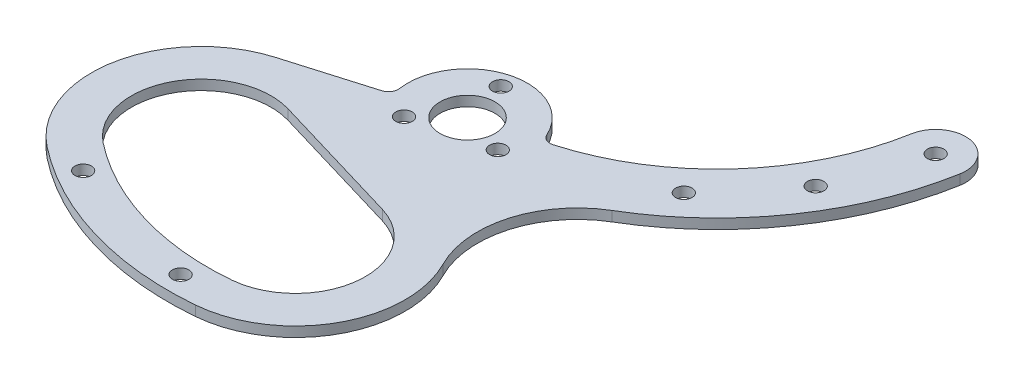
ISO-10303-21;
HEADER;
FILE_DESCRIPTION(('STEP AP214'),'2;1');
FILE_NAME('part.step','',(''),(''),'','','');
FILE_SCHEMA(('AUTOMOTIVE_DESIGN { 1 0 10303 214 1 1 1 1 }'));
ENDSEC;
DATA;
#1=APPLICATION_CONTEXT('core data for automotive mechanical design processes');
#2=APPLICATION_PROTOCOL_DEFINITION('international standard','automotive_design',2000,#1);
#3=PRODUCT_CONTEXT('',#1,'mechanical');
#4=PRODUCT('Part','Part','',(#3));
#5=PRODUCT_RELATED_PRODUCT_CATEGORY('part','',(#4));
#6=PRODUCT_DEFINITION_FORMATION('','',#4);
#7=PRODUCT_DEFINITION_CONTEXT('part definition',#1,'design');
#8=PRODUCT_DEFINITION('design','',#6,#7);
#9=PRODUCT_DEFINITION_SHAPE('','',#8);
#10=(LENGTH_UNIT() NAMED_UNIT(*) SI_UNIT(.MILLI.,.METRE.));
#11=(NAMED_UNIT(*) PLANE_ANGLE_UNIT() SI_UNIT($,.RADIAN.));
#12=(NAMED_UNIT(*) SI_UNIT($,.STERADIAN.) SOLID_ANGLE_UNIT());
#13=UNCERTAINTY_MEASURE_WITH_UNIT(LENGTH_MEASURE(1.E-05),#10,'distance_accuracy_value','');
#14=(GEOMETRIC_REPRESENTATION_CONTEXT(3) GLOBAL_UNCERTAINTY_ASSIGNED_CONTEXT((#13)) GLOBAL_UNIT_ASSIGNED_CONTEXT((#10,
#11,#12)) REPRESENTATION_CONTEXT('',''));
#15=CARTESIAN_POINT('',(0.,0.,0.));
#16=DIRECTION('',(0.,0.,1.));
#17=DIRECTION('',(1.,0.,0.));
#18=AXIS2_PLACEMENT_3D('',#15,#16,#17);
#19=CARTESIAN_POINT('',(53.1796186626592,2.,-40.6229984059855));
#20=DIRECTION('',(0.,-1.,0.));
#21=DIRECTION('',(0.,0.,-1.));
#22=AXIS2_PLACEMENT_3D('',#19,#20,#21);
#23=PLANE('',#22);
#24=CARTESIAN_POINT('',(-1.5107921294575,2.,55.9796168899142));
#25=DIRECTION('',(0.,1.,0.));
#26=DIRECTION('',(0.,0.,-1.));
#27=AXIS2_PLACEMENT_3D('',#24,#25,#26);
#28=CIRCLE('',#27,1.64999999999998);
#29=CARTESIAN_POINT('',(-1.5107921294575,2.,54.3296168899142));
#30=VERTEX_POINT('',#29);
#31=EDGE_CURVE('E187',#30,#30,#28,.T.);
#32=ORIENTED_EDGE('',*,*,#31,.F.);
#33=EDGE_LOOP('',(#32));
#34=FACE_BOUND('',#33,.T.);
#35=CARTESIAN_POINT('',(-29.298192808905,2.,47.7243742560574));
#36=DIRECTION('',(0.,1.,0.));
#37=DIRECTION('',(0.,0.,1.));
#38=AXIS2_PLACEMENT_3D('',#35,#36,#37);
#39=CIRCLE('',#38,1.65);
#40=CARTESIAN_POINT('',(-29.298192808905,2.,49.3743742560573));
#41=VERTEX_POINT('',#40);
#42=EDGE_CURVE('E193',#41,#41,#39,.T.);
#43=ORIENTED_EDGE('',*,*,#42,.F.);
#44=EDGE_LOOP('',(#43));
#45=FACE_BOUND('',#44,.T.);
#46=CARTESIAN_POINT('',(53.1796186626592,2.,-40.6229984059855));
#47=DIRECTION('',(0.,1.,0.));
#48=DIRECTION('',(0.,0.,-1.));
#49=AXIS2_PLACEMENT_3D('',#46,#47,#48);
#50=CIRCLE('',#49,5.99999999999999);
#51=CARTESIAN_POINT('',(59.0884651807324,2.,-39.5811093399839));
#52=VERTEX_POINT('',#51);
#53=CARTESIAN_POINT('',(47.2707721445859,2.,-41.6648874719871));
#54=VERTEX_POINT('',#53);
#55=EDGE_CURVE('E199',#52,#54,#50,.T.);
#56=ORIENTED_EDGE('',*,*,#55,.T.);
#57=CARTESIAN_POINT('',(0.,2.,-50.));
#58=DIRECTION('',(0.,-1.,0.));
#59=DIRECTION('',(0.,0.,-1.));
#60=AXIS2_PLACEMENT_3D('',#57,#58,#59);
#61=CIRCLE('',#60,48.);
#62=CARTESIAN_POINT('',(13.2960587989118,2.,-3.87826086956521));
#63=VERTEX_POINT('',#62);
#64=EDGE_CURVE('E202',#54,#63,#61,.T.);
#65=ORIENTED_EDGE('',*,*,#64,.T.);
#66=CARTESIAN_POINT('',(12.7420563489572,2.,-5.8));
#67=DIRECTION('',(0.,-1.,0.));
#68=DIRECTION('',(0.,0.,-1.));
#69=AXIS2_PLACEMENT_3D('',#66,#67,#68);
#70=CIRCLE('',#69,2.);
#71=CARTESIAN_POINT('',(10.9217625848204,2.,-4.97142857142857));
#72=VERTEX_POINT('',#71);
#73=EDGE_CURVE('E11',#63,#72,#70,.T.);
#74=ORIENTED_EDGE('',*,*,#73,.T.);
#75=CARTESIAN_POINT('',(0.,2.,0.));
#76=DIRECTION('',(0.,1.,0.));
#77=DIRECTION('',(0.,0.,1.));
#78=AXIS2_PLACEMENT_3D('',#75,#76,#77);
#79=CIRCLE('',#78,12.);
#80=CARTESIAN_POINT('',(-11.875935655694,2.,1.72109043975488));
#81=VERTEX_POINT('',#80);
#82=EDGE_CURVE('E205',#72,#81,#79,.T.);
#83=ORIENTED_EDGE('',*,*,#82,.T.);
#84=CARTESIAN_POINT('',(-13.8552582649763,2.,2.00793884638069));
#85=DIRECTION('',(0.,-1.,0.));
#86=DIRECTION('',(0.,0.,-1.));
#87=AXIS2_PLACEMENT_3D('',#84,#85,#86);
#88=CIRCLE('',#87,2.);
#89=CARTESIAN_POINT('',(-13.2885915983097,2.,3.92598183048946));
#90=VERTEX_POINT('',#89);
#91=EDGE_CURVE('E270',#81,#90,#88,.T.);
#92=ORIENTED_EDGE('',*,*,#91,.T.);
#93=DIRECTION('',(-0.959021492054387,0.,0.283333333333334));
#94=VECTOR('',#93,1.);
#95=CARTESIAN_POINT('',(-11.5082579046526,2.,3.40000000000001));
#96=LINE('',#95,#94);
#97=CARTESIAN_POINT('',(-29.714194139053,2.,8.7787622514035));
#98=VERTEX_POINT('',#97);
#99=EDGE_CURVE('E208',#90,#98,#96,.T.);
#100=ORIENTED_EDGE('',*,*,#99,.T.);
#101=CARTESIAN_POINT('',(-23.4808608057197,2.,29.8772350766));
#102=DIRECTION('',(0.,1.,0.));
#103=DIRECTION('',(0.,0.,-1.));
#104=AXIS2_PLACEMENT_3D('',#101,#102,#103);
#105=CIRCLE('',#104,22.);
#106=CARTESIAN_POINT('',(-37.0750433774521,2.,47.1745816998947));
#107=VERTEX_POINT('',#106);
#108=EDGE_CURVE('E210',#98,#107,#105,.T.);
#109=ORIENTED_EDGE('',*,*,#108,.T.);
#110=CARTESIAN_POINT('',(0.,2.,0.));
#111=DIRECTION('',(0.,1.,0.));
#112=DIRECTION('',(0.,0.,-1.));
#113=AXIS2_PLACEMENT_3D('',#110,#111,#112);
#114=CIRCLE('',#113,60.);
#115=CARTESIAN_POINT('',(5.30480077263312,2.,59.7650323246183));
#116=VERTEX_POINT('',#115);
#117=EDGE_CURVE('E212',#107,#116,#114,.T.);
#118=ORIENTED_EDGE('',*,*,#117,.T.);
#119=CARTESIAN_POINT('',(3.35970715600097,2.,37.8511871389249));
#120=DIRECTION('',(0.,1.,0.));
#121=DIRECTION('',(0.,0.,1.));
#122=AXIS2_PLACEMENT_3D('',#119,#120,#121);
#123=CIRCLE('',#122,22.);
#124=CARTESIAN_POINT('',(22.9702579298318,2.,27.8799134817132));
#125=VERTEX_POINT('',#124);
#126=EDGE_CURVE('E214',#116,#125,#123,.T.);
#127=ORIENTED_EDGE('',*,*,#126,.T.);
#128=CARTESIAN_POINT('',(40.7980313605871,2.,18.8151192478844));
#129=DIRECTION('',(0.,-1.,0.));
#130=DIRECTION('',(0.,0.,1.));
#131=AXIS2_PLACEMENT_3D('',#128,#129,#130);
#132=CIRCLE('',#131,20.);
#133=CARTESIAN_POINT('',(30.5985235204403,2.,1.61133943591332));
#134=VERTEX_POINT('',#133);
#135=EDGE_CURVE('E216',#125,#134,#132,.T.);
#136=ORIENTED_EDGE('',*,*,#135,.T.);
#137=CARTESIAN_POINT('',(0.,2.,-50.));
#138=DIRECTION('',(0.,1.,0.));
#139=DIRECTION('',(0.,0.,-1.));
#140=AXIS2_PLACEMENT_3D('',#137,#138,#139);
#141=CIRCLE('',#140,60.);
#142=EDGE_CURVE('E218',#134,#52,#141,.T.);
#143=ORIENTED_EDGE('',*,*,#142,.T.);
#144=EDGE_LOOP('',(#56,#65,#74,#83,#92,#100,#109,#118,#127,#136,#143));
#145=FACE_BOUND('',#144,.T.);
#146=CARTESIAN_POINT('',(-23.4808608057197,2.,29.8772350766));
#147=DIRECTION('',(0.,1.,0.));
#148=DIRECTION('',(0.,0.,-1.));
#149=AXIS2_PLACEMENT_3D('',#146,#147,#148);
#150=CIRCLE('',#149,14.);
#151=CARTESIAN_POINT('',(-19.4938847745572,2.,16.4569510957397));
#152=VERTEX_POINT('',#151);
#153=CARTESIAN_POINT('',(-32.1317042604585,2.,40.8846374732421));
#154=VERTEX_POINT('',#153);
#155=EDGE_CURVE('E143',#152,#154,#150,.T.);
#156=ORIENTED_EDGE('',*,*,#155,.F.);
#157=DIRECTION('',(-0.958591712918594,0.,-0.28478400222589));
#158=VECTOR('',#157,1.);
#159=CARTESIAN_POINT('',(-19.4938847745572,2.,16.4569510957397));
#160=LINE('',#159,#158);
#161=CARTESIAN_POINT('',(7.34668318716343,2.,24.4309031580646));
#162=VERTEX_POINT('',#161);
#163=EDGE_CURVE('E169',#162,#152,#160,.T.);
#164=ORIENTED_EDGE('',*,*,#163,.F.);
#165=CARTESIAN_POINT('',(3.35970715600097,2.,37.8511871389249));
#166=DIRECTION('',(0.,1.,0.));
#167=DIRECTION('',(0.,0.,1.));
#168=AXIS2_PLACEMENT_3D('',#165,#166,#167);
#169=CIRCLE('',#168,14.);
#170=CARTESIAN_POINT('',(4.59749400294866,2.,51.7963613480025));
#171=VERTEX_POINT('',#170);
#172=EDGE_CURVE('E167',#171,#162,#169,.T.);
#173=ORIENTED_EDGE('',*,*,#172,.F.);
#174=CARTESIAN_POINT('',(0.,2.,0.));
#175=DIRECTION('',(0.,1.,0.));
#176=DIRECTION('',(0.,0.,1.));
#177=AXIS2_PLACEMENT_3D('',#174,#175,#176);
#178=CIRCLE('',#177,52.);
#179=EDGE_CURVE('E153',#154,#171,#178,.T.);
#180=ORIENTED_EDGE('',*,*,#179,.F.);
#181=EDGE_LOOP('',(#156,#164,#173,#180));
#182=FACE_BOUND('',#181,.T.);
#183=CARTESIAN_POINT('',(8.62732541626735,2.,2.56305602003301));
#184=DIRECTION('',(0.,1.,0.));
#185=DIRECTION('',(0.,0.,1.));
#186=AXIS2_PLACEMENT_3D('',#183,#184,#185);
#187=CIRCLE('',#186,1.65);
#188=CARTESIAN_POINT('',(8.62732541626735,2.,4.21305602003302));
#189=VERTEX_POINT('',#188);
#190=EDGE_CURVE('E176',#189,#189,#187,.T.);
#191=ORIENTED_EDGE('',*,*,#190,.F.);
#192=EDGE_LOOP('',(#191));
#193=FACE_BOUND('',#192,.T.);
#194=CARTESIAN_POINT('',(0.,2.,0.));
#195=DIRECTION('',(0.,1.,0.));
#196=DIRECTION('',(0.,0.,1.));
#197=AXIS2_PLACEMENT_3D('',#194,#195,#196);
#198=CIRCLE('',#197,5.5);
#199=CARTESIAN_POINT('',(0.,2.,5.5));
#200=VERTEX_POINT('',#199);
#201=EDGE_CURVE('E589',#200,#200,#198,.T.);
#202=ORIENTED_EDGE('',*,*,#201,.F.);
#203=EDGE_LOOP('',(#202));
#204=FACE_BOUND('',#203,.T.);
#205=CARTESIAN_POINT('',(-6.5333343328049,2.,6.18995496718617));
#206=DIRECTION('',(0.,1.,0.));
#207=DIRECTION('',(0.,0.,1.));
#208=AXIS2_PLACEMENT_3D('',#205,#206,#207);
#209=CIRCLE('',#208,1.65);
#210=CARTESIAN_POINT('',(-6.5333343328049,2.,7.83995496718617));
#211=VERTEX_POINT('',#210);
#212=EDGE_CURVE('E583',#211,#211,#209,.T.);
#213=ORIENTED_EDGE('',*,*,#212,.F.);
#214=EDGE_LOOP('',(#213));
#215=FACE_BOUND('',#214,.T.);
#216=CARTESIAN_POINT('',(-2.09399108346244,2.,-8.75301098721919));
#217=DIRECTION('',(0.,1.,0.));
#218=DIRECTION('',(0.,0.,1.));
#219=AXIS2_PLACEMENT_3D('',#216,#217,#218);
#220=CIRCLE('',#219,1.65);
#221=CARTESIAN_POINT('',(-2.09399108346244,2.,-7.10301098721919));
#222=VERTEX_POINT('',#221);
#223=EDGE_CURVE('E577',#222,#222,#220,.T.);
#224=ORIENTED_EDGE('',*,*,#223,.F.);
#225=EDGE_LOOP('',(#224));
#226=FACE_BOUND('',#225,.T.);
#227=CARTESIAN_POINT('',(53.1796186626592,2.,-40.6229984059855));
#228=DIRECTION('',(0.,1.,0.));
#229=DIRECTION('',(0.,0.,1.));
#230=AXIS2_PLACEMENT_3D('',#227,#228,#229);
#231=CIRCLE('',#230,1.65);
#232=CARTESIAN_POINT('',(53.1796186626592,2.,-38.9729984059855));
#233=VERTEX_POINT('',#232);
#234=EDGE_CURVE('E571',#233,#233,#231,.T.);
#235=ORIENTED_EDGE('',*,*,#234,.F.);
#236=EDGE_LOOP('',(#235));
#237=FACE_BOUND('',#236,.T.);
#238=CARTESIAN_POINT('',(46.7653718043596,2.,-22.9999999999998));
#239=DIRECTION('',(0.,1.,0.));
#240=DIRECTION('',(0.,0.,1.));
#241=AXIS2_PLACEMENT_3D('',#238,#239,#240);
#242=CIRCLE('',#241,1.65);
#243=CARTESIAN_POINT('',(46.7653718043596,2.,-21.3499999999998));
#244=VERTEX_POINT('',#243);
#245=EDGE_CURVE('E565',#244,#244,#242,.T.);
#246=ORIENTED_EDGE('',*,*,#245,.F.);
#247=EDGE_LOOP('',(#246));
#248=FACE_BOUND('',#247,.T.);
#249=CARTESIAN_POINT('',(34.7105309230729,2.,-8.63360007157498));
#250=DIRECTION('',(0.,1.,0.));
#251=DIRECTION('',(0.,0.,1.));
#252=AXIS2_PLACEMENT_3D('',#249,#250,#251);
#253=CIRCLE('',#252,1.65);
#254=CARTESIAN_POINT('',(34.7105309230729,2.,-6.98360007157498));
#255=VERTEX_POINT('',#254);
#256=EDGE_CURVE('E556',#255,#255,#253,.T.);
#257=ORIENTED_EDGE('',*,*,#256,.F.);
#258=EDGE_LOOP('',(#257));
#259=FACE_BOUND('',#258,.T.);
#260=ADVANCED_FACE('F37',(#34,#45,#145,#182,#193,#204,#215,#226,#237,#248,#259),#23,.F.);
#261=CARTESIAN_POINT('',(53.1796186626592,0.,-40.6229984059855));
#262=DIRECTION('',(0.,-1.,0.));
#263=DIRECTION('',(0.,0.,-1.));
#264=AXIS2_PLACEMENT_3D('',#261,#262,#263);
#265=PLANE('',#264);
#266=CARTESIAN_POINT('',(46.7653718043596,0.,-22.9999999999998));
#267=DIRECTION('',(0.,1.,0.));
#268=DIRECTION('',(0.,0.,1.));
#269=AXIS2_PLACEMENT_3D('',#266,#267,#268);
#270=CIRCLE('',#269,1.65);
#271=CARTESIAN_POINT('',(46.7653718043596,0.,-21.3499999999998));
#272=VERTEX_POINT('',#271);
#273=EDGE_CURVE('E562',#272,#272,#270,.T.);
#274=ORIENTED_EDGE('',*,*,#273,.T.);
#275=EDGE_LOOP('',(#274));
#276=FACE_BOUND('',#275,.T.);
#277=CARTESIAN_POINT('',(-2.09399108346244,0.,-8.75301098721919));
#278=DIRECTION('',(0.,1.,0.));
#279=DIRECTION('',(0.,0.,1.));
#280=AXIS2_PLACEMENT_3D('',#277,#278,#279);
#281=CIRCLE('',#280,1.65);
#282=CARTESIAN_POINT('',(-2.09399108346244,0.,-7.10301098721919));
#283=VERTEX_POINT('',#282);
#284=EDGE_CURVE('E574',#283,#283,#281,.T.);
#285=ORIENTED_EDGE('',*,*,#284,.T.);
#286=EDGE_LOOP('',(#285));
#287=FACE_BOUND('',#286,.T.);
#288=CARTESIAN_POINT('',(0.,0.,0.));
#289=DIRECTION('',(0.,1.,0.));
#290=DIRECTION('',(0.,0.,1.));
#291=AXIS2_PLACEMENT_3D('',#288,#289,#290);
#292=CIRCLE('',#291,5.5);
#293=CARTESIAN_POINT('',(0.,0.,5.5));
#294=VERTEX_POINT('',#293);
#295=EDGE_CURVE('E586',#294,#294,#292,.T.);
#296=ORIENTED_EDGE('',*,*,#295,.T.);
#297=EDGE_LOOP('',(#296));
#298=FACE_BOUND('',#297,.T.);
#299=DIRECTION('',(-0.958591712918594,0.,-0.28478400222589));
#300=VECTOR('',#299,1.);
#301=CARTESIAN_POINT('',(-19.4938847745572,0.,16.4569510957397));
#302=LINE('',#301,#300);
#303=CARTESIAN_POINT('',(7.34668318716343,0.,24.4309031580646));
#304=VERTEX_POINT('',#303);
#305=CARTESIAN_POINT('',(-19.4938847745572,0.,16.4569510957397));
#306=VERTEX_POINT('',#305);
#307=EDGE_CURVE('E154',#304,#306,#302,.T.);
#308=ORIENTED_EDGE('',*,*,#307,.T.);
#309=CARTESIAN_POINT('',(-23.4808608057197,0.,29.8772350766));
#310=DIRECTION('',(0.,1.,0.));
#311=DIRECTION('',(0.,0.,-1.));
#312=AXIS2_PLACEMENT_3D('',#309,#310,#311);
#313=CIRCLE('',#312,14.);
#314=CARTESIAN_POINT('',(-32.1317042604585,0.,40.8846374732421));
#315=VERTEX_POINT('',#314);
#316=EDGE_CURVE('E174',#306,#315,#313,.T.);
#317=ORIENTED_EDGE('',*,*,#316,.T.);
#318=CARTESIAN_POINT('',(0.,0.,0.));
#319=DIRECTION('',(0.,1.,0.));
#320=DIRECTION('',(0.,0.,1.));
#321=AXIS2_PLACEMENT_3D('',#318,#319,#320);
#322=CIRCLE('',#321,52.);
#323=CARTESIAN_POINT('',(4.59749400294866,0.,51.7963613480025));
#324=VERTEX_POINT('',#323);
#325=EDGE_CURVE('E160',#315,#324,#322,.T.);
#326=ORIENTED_EDGE('',*,*,#325,.T.);
#327=CARTESIAN_POINT('',(3.35970715600097,0.,37.8511871389249));
#328=DIRECTION('',(0.,1.,0.));
#329=DIRECTION('',(0.,0.,1.));
#330=AXIS2_PLACEMENT_3D('',#327,#328,#329);
#331=CIRCLE('',#330,14.);
#332=EDGE_CURVE('E178',#324,#304,#331,.T.);
#333=ORIENTED_EDGE('',*,*,#332,.T.);
#334=EDGE_LOOP('',(#308,#317,#326,#333));
#335=FACE_BOUND('',#334,.T.);
#336=CARTESIAN_POINT('',(-1.5107921294575,0.,55.9796168899142));
#337=DIRECTION('',(0.,1.,0.));
#338=DIRECTION('',(0.,0.,-1.));
#339=AXIS2_PLACEMENT_3D('',#336,#337,#338);
#340=CIRCLE('',#339,1.64999999999998);
#341=CARTESIAN_POINT('',(-1.5107921294575,0.,54.3296168899142));
#342=VERTEX_POINT('',#341);
#343=EDGE_CURVE('E161',#342,#342,#340,.T.);
#344=ORIENTED_EDGE('',*,*,#343,.T.);
#345=EDGE_LOOP('',(#344));
#346=FACE_BOUND('',#345,.T.);
#347=CARTESIAN_POINT('',(53.1796186626592,0.,-40.6229984059855));
#348=DIRECTION('',(0.,1.,0.));
#349=DIRECTION('',(0.,0.,-1.));
#350=AXIS2_PLACEMENT_3D('',#347,#348,#349);
#351=CIRCLE('',#350,5.99999999999999);
#352=CARTESIAN_POINT('',(59.0884651807324,0.,-39.5811093399839));
#353=VERTEX_POINT('',#352);
#354=CARTESIAN_POINT('',(47.2707721445859,0.,-41.6648874719871));
#355=VERTEX_POINT('',#354);
#356=EDGE_CURVE('E196',#353,#355,#351,.T.);
#357=ORIENTED_EDGE('',*,*,#356,.F.);
#358=CARTESIAN_POINT('',(0.,0.,-50.));
#359=DIRECTION('',(0.,1.,0.));
#360=DIRECTION('',(0.,0.,-1.));
#361=AXIS2_PLACEMENT_3D('',#358,#359,#360);
#362=CIRCLE('',#361,60.);
#363=CARTESIAN_POINT('',(30.5985235204403,0.,1.61133943591332));
#364=VERTEX_POINT('',#363);
#365=EDGE_CURVE('E203',#364,#353,#362,.T.);
#366=ORIENTED_EDGE('',*,*,#365,.F.);
#367=CARTESIAN_POINT('',(40.7980313605871,0.,18.8151192478844));
#368=DIRECTION('',(0.,-1.,0.));
#369=DIRECTION('',(0.,0.,1.));
#370=AXIS2_PLACEMENT_3D('',#367,#368,#369);
#371=CIRCLE('',#370,20.);
#372=CARTESIAN_POINT('',(22.9702579298318,0.,27.8799134817132));
#373=VERTEX_POINT('',#372);
#374=EDGE_CURVE('E236',#373,#364,#371,.T.);
#375=ORIENTED_EDGE('',*,*,#374,.F.);
#376=CARTESIAN_POINT('',(3.35970715600097,0.,37.8511871389249));
#377=DIRECTION('',(0.,1.,0.));
#378=DIRECTION('',(0.,0.,1.));
#379=AXIS2_PLACEMENT_3D('',#376,#377,#378);
#380=CIRCLE('',#379,22.);
#381=CARTESIAN_POINT('',(5.30480077263312,0.,59.7650323246183));
#382=VERTEX_POINT('',#381);
#383=EDGE_CURVE('E234',#382,#373,#380,.T.);
#384=ORIENTED_EDGE('',*,*,#383,.F.);
#385=CARTESIAN_POINT('',(0.,0.,0.));
#386=DIRECTION('',(0.,1.,0.));
#387=DIRECTION('',(0.,0.,-1.));
#388=AXIS2_PLACEMENT_3D('',#385,#386,#387);
#389=CIRCLE('',#388,60.);
#390=CARTESIAN_POINT('',(-37.0750433774521,0.,47.1745816998947));
#391=VERTEX_POINT('',#390);
#392=EDGE_CURVE('E232',#391,#382,#389,.T.);
#393=ORIENTED_EDGE('',*,*,#392,.F.);
#394=CARTESIAN_POINT('',(-23.4808608057197,0.,29.8772350766));
#395=DIRECTION('',(0.,1.,0.));
#396=DIRECTION('',(0.,0.,-1.));
#397=AXIS2_PLACEMENT_3D('',#394,#395,#396);
#398=CIRCLE('',#397,22.);
#399=CARTESIAN_POINT('',(-29.714194139053,0.,8.7787622514035));
#400=VERTEX_POINT('',#399);
#401=EDGE_CURVE('E230',#400,#391,#398,.T.);
#402=ORIENTED_EDGE('',*,*,#401,.F.);
#403=DIRECTION('',(-0.959021492054387,0.,0.283333333333334));
#404=VECTOR('',#403,1.);
#405=CARTESIAN_POINT('',(-11.5082579046526,0.,3.40000000000001));
#406=LINE('',#405,#404);
#407=CARTESIAN_POINT('',(-13.2885915983097,0.,3.92598183048946));
#408=VERTEX_POINT('',#407);
#409=EDGE_CURVE('E228',#408,#400,#406,.T.);
#410=ORIENTED_EDGE('',*,*,#409,.F.);
#411=CARTESIAN_POINT('',(-13.8552582649763,0.,2.00793884638069));
#412=DIRECTION('',(0.,-1.,0.));
#413=DIRECTION('',(0.,0.,-1.));
#414=AXIS2_PLACEMENT_3D('',#411,#412,#413);
#415=CIRCLE('',#414,2.);
#416=CARTESIAN_POINT('',(-11.875935655694,0.,1.72109043975488));
#417=VERTEX_POINT('',#416);
#418=EDGE_CURVE('E268',#408,#417,#415,.F.);
#419=ORIENTED_EDGE('',*,*,#418,.T.);
#420=CARTESIAN_POINT('',(0.,0.,0.));
#421=DIRECTION('',(0.,1.,0.));
#422=DIRECTION('',(0.,0.,1.));
#423=AXIS2_PLACEMENT_3D('',#420,#421,#422);
#424=CIRCLE('',#423,12.);
#425=CARTESIAN_POINT('',(10.9217625848204,0.,-4.97142857142857));
#426=VERTEX_POINT('',#425);
#427=EDGE_CURVE('E225',#426,#417,#424,.T.);
#428=ORIENTED_EDGE('',*,*,#427,.F.);
#429=CARTESIAN_POINT('',(12.7420563489572,0.,-5.8));
#430=DIRECTION('',(0.,-1.,0.));
#431=DIRECTION('',(0.,0.,-1.));
#432=AXIS2_PLACEMENT_3D('',#429,#430,#431);
#433=CIRCLE('',#432,2.);
#434=CARTESIAN_POINT('',(13.2960587989118,0.,-3.87826086956521));
#435=VERTEX_POINT('',#434);
#436=EDGE_CURVE('E45',#426,#435,#433,.F.);
#437=ORIENTED_EDGE('',*,*,#436,.T.);
#438=CARTESIAN_POINT('',(0.,0.,-50.));
#439=DIRECTION('',(0.,-1.,0.));
#440=DIRECTION('',(0.,0.,-1.));
#441=AXIS2_PLACEMENT_3D('',#438,#439,#440);
#442=CIRCLE('',#441,48.);
#443=EDGE_CURVE('E223',#355,#435,#442,.T.);
#444=ORIENTED_EDGE('',*,*,#443,.F.);
#445=EDGE_LOOP('',(#357,#366,#375,#384,#393,#402,#410,#419,#428,#437,#444));
#446=FACE_BOUND('',#445,.T.);
#447=CARTESIAN_POINT('',(-29.298192808905,0.,47.7243742560574));
#448=DIRECTION('',(0.,1.,0.));
#449=DIRECTION('',(0.,0.,1.));
#450=AXIS2_PLACEMENT_3D('',#447,#448,#449);
#451=CIRCLE('',#450,1.65);
#452=CARTESIAN_POINT('',(-29.298192808905,0.,49.3743742560573));
#453=VERTEX_POINT('',#452);
#454=EDGE_CURVE('E190',#453,#453,#451,.T.);
#455=ORIENTED_EDGE('',*,*,#454,.T.);
#456=EDGE_LOOP('',(#455));
#457=FACE_BOUND('',#456,.T.);
#458=CARTESIAN_POINT('',(8.62732541626735,0.,2.56305602003301));
#459=DIRECTION('',(0.,1.,0.));
#460=DIRECTION('',(0.,0.,1.));
#461=AXIS2_PLACEMENT_3D('',#458,#459,#460);
#462=CIRCLE('',#461,1.65);
#463=CARTESIAN_POINT('',(8.62732541626735,0.,4.21305602003302));
#464=VERTEX_POINT('',#463);
#465=EDGE_CURVE('E592',#464,#464,#462,.T.);
#466=ORIENTED_EDGE('',*,*,#465,.T.);
#467=EDGE_LOOP('',(#466));
#468=FACE_BOUND('',#467,.T.);
#469=CARTESIAN_POINT('',(-6.5333343328049,0.,6.18995496718617));
#470=DIRECTION('',(0.,1.,0.));
#471=DIRECTION('',(0.,0.,1.));
#472=AXIS2_PLACEMENT_3D('',#469,#470,#471);
#473=CIRCLE('',#472,1.65);
#474=CARTESIAN_POINT('',(-6.5333343328049,0.,7.83995496718617));
#475=VERTEX_POINT('',#474);
#476=EDGE_CURVE('E580',#475,#475,#473,.T.);
#477=ORIENTED_EDGE('',*,*,#476,.T.);
#478=EDGE_LOOP('',(#477));
#479=FACE_BOUND('',#478,.T.);
#480=CARTESIAN_POINT('',(53.1796186626592,0.,-40.6229984059855));
#481=DIRECTION('',(0.,1.,0.));
#482=DIRECTION('',(0.,0.,1.));
#483=AXIS2_PLACEMENT_3D('',#480,#481,#482);
#484=CIRCLE('',#483,1.65);
#485=CARTESIAN_POINT('',(53.1796186626592,0.,-38.9729984059855));
#486=VERTEX_POINT('',#485);
#487=EDGE_CURVE('E568',#486,#486,#484,.T.);
#488=ORIENTED_EDGE('',*,*,#487,.T.);
#489=EDGE_LOOP('',(#488));
#490=FACE_BOUND('',#489,.T.);
#491=CARTESIAN_POINT('',(34.7105309230729,0.,-8.63360007157498));
#492=DIRECTION('',(0.,1.,0.));
#493=DIRECTION('',(0.,0.,1.));
#494=AXIS2_PLACEMENT_3D('',#491,#492,#493);
#495=CIRCLE('',#494,1.65);
#496=CARTESIAN_POINT('',(34.7105309230729,0.,-6.98360007157498));
#497=VERTEX_POINT('',#496);
#498=EDGE_CURVE('E559',#497,#497,#495,.T.);
#499=ORIENTED_EDGE('',*,*,#498,.T.);
#500=EDGE_LOOP('',(#499));
#501=FACE_BOUND('',#500,.T.);
#502=ADVANCED_FACE('F285',(#276,#287,#298,#335,#346,#446,#457,#468,#479,#490,#501),#265,.T.);
#503=CARTESIAN_POINT('',(53.1796186626592,2.,-40.6229984059855));
#504=DIRECTION('',(0.,-1.,0.));
#505=DIRECTION('',(0.,0.,-1.));
#506=AXIS2_PLACEMENT_3D('',#503,#504,#505);
#507=CYLINDRICAL_SURFACE('',#506,5.99999999999999);
#508=ORIENTED_EDGE('',*,*,#356,.T.);
#509=DIRECTION('',(0.,-1.,0.));
#510=VECTOR('',#509,1.);
#511=CARTESIAN_POINT('',(47.2707721445859,2.,-41.6648874719871));
#512=LINE('',#511,#510);
#513=EDGE_CURVE('E256',#54,#355,#512,.T.);
#514=ORIENTED_EDGE('',*,*,#513,.F.);
#515=ORIENTED_EDGE('',*,*,#55,.F.);
#516=DIRECTION('',(0.,-1.,0.));
#517=VECTOR('',#516,1.);
#518=CARTESIAN_POINT('',(59.0884651807324,2.,-39.5811093399839));
#519=LINE('',#518,#517);
#520=EDGE_CURVE('E220',#52,#353,#519,.T.);
#521=ORIENTED_EDGE('',*,*,#520,.T.);
#522=EDGE_LOOP('',(#508,#514,#515,#521));
#523=FACE_BOUND('',#522,.T.);
#524=ADVANCED_FACE('F297',(#523),#507,.T.);
#525=CARTESIAN_POINT('',(0.,2.,-50.));
#526=DIRECTION('',(0.,-1.,0.));
#527=DIRECTION('',(0.,0.,-1.));
#528=AXIS2_PLACEMENT_3D('',#525,#526,#527);
#529=CYLINDRICAL_SURFACE('',#528,48.);
#530=ORIENTED_EDGE('',*,*,#443,.T.);
#531=DIRECTION('',(0.,-1.,0.));
#532=VECTOR('',#531,1.);
#533=CARTESIAN_POINT('',(13.2960587989118,2.,-3.87826086956521));
#534=LINE('',#533,#532);
#535=EDGE_CURVE('E52',#435,#63,#534,.F.);
#536=ORIENTED_EDGE('',*,*,#535,.T.);
#537=ORIENTED_EDGE('',*,*,#64,.F.);
#538=ORIENTED_EDGE('',*,*,#513,.T.);
#539=EDGE_LOOP('',(#530,#536,#537,#538));
#540=FACE_BOUND('',#539,.T.);
#541=ADVANCED_FACE('F295',(#540),#529,.F.);
#542=CARTESIAN_POINT('',(0.,2.,0.));
#543=DIRECTION('',(0.,-1.,0.));
#544=DIRECTION('',(0.,0.,-1.));
#545=AXIS2_PLACEMENT_3D('',#542,#543,#544);
#546=CYLINDRICAL_SURFACE('',#545,12.);
#547=ORIENTED_EDGE('',*,*,#427,.T.);
#548=DIRECTION('',(0.,-1.,0.));
#549=VECTOR('',#548,1.);
#550=CARTESIAN_POINT('',(-11.875935655694,2.,1.72109043975488));
#551=LINE('',#550,#549);
#552=EDGE_CURVE('E265',#417,#81,#551,.F.);
#553=ORIENTED_EDGE('',*,*,#552,.T.);
#554=ORIENTED_EDGE('',*,*,#82,.F.);
#555=DIRECTION('',(0.,-1.,0.));
#556=VECTOR('',#555,1.);
#557=CARTESIAN_POINT('',(10.9217625848204,2.,-4.97142857142858));
#558=LINE('',#557,#556);
#559=EDGE_CURVE('E262',#72,#426,#558,.T.);
#560=ORIENTED_EDGE('',*,*,#559,.T.);
#561=EDGE_LOOP('',(#547,#553,#554,#560));
#562=FACE_BOUND('',#561,.T.);
#563=ADVANCED_FACE('F289',(#562),#546,.T.);
#564=CARTESIAN_POINT('',(-11.5082579046526,2.,3.40000000000001));
#565=DIRECTION('',(0.283333333333334,0.,0.959021492054387));
#566=DIRECTION('',(0.959021492054387,0.,-0.283333333333334));
#567=AXIS2_PLACEMENT_3D('',#564,#565,#566);
#568=PLANE('',#567);
#569=ORIENTED_EDGE('',*,*,#99,.F.);
#570=DIRECTION('',(0.,1.,0.));
#571=VECTOR('',#570,1.);
#572=CARTESIAN_POINT('',(-13.2885915983097,0.,3.92598183048946));
#573=LINE('',#572,#571);
#574=EDGE_CURVE('E259',#90,#408,#573,.F.);
#575=ORIENTED_EDGE('',*,*,#574,.T.);
#576=ORIENTED_EDGE('',*,*,#409,.T.);
#577=DIRECTION('',(0.,-1.,0.));
#578=VECTOR('',#577,1.);
#579=CARTESIAN_POINT('',(-29.714194139053,2.,8.7787622514035));
#580=LINE('',#579,#578);
#581=EDGE_CURVE('E253',#98,#400,#580,.T.);
#582=ORIENTED_EDGE('',*,*,#581,.F.);
#583=EDGE_LOOP('',(#569,#575,#576,#582));
#584=FACE_BOUND('',#583,.T.);
#585=ADVANCED_FACE('F280',(#584),#568,.F.);
#586=CARTESIAN_POINT('',(-23.4808608057197,2.,29.8772350766));
#587=DIRECTION('',(0.,-1.,0.));
#588=DIRECTION('',(0.,0.,-1.));
#589=AXIS2_PLACEMENT_3D('',#586,#587,#588);
#590=CYLINDRICAL_SURFACE('',#589,22.);
#591=ORIENTED_EDGE('',*,*,#401,.T.);
#592=DIRECTION('',(0.,-1.,0.));
#593=VECTOR('',#592,1.);
#594=CARTESIAN_POINT('',(-37.0750433774521,2.,47.1745816998947));
#595=LINE('',#594,#593);
#596=EDGE_CURVE('E250',#107,#391,#595,.T.);
#597=ORIENTED_EDGE('',*,*,#596,.F.);
#598=ORIENTED_EDGE('',*,*,#108,.F.);
#599=ORIENTED_EDGE('',*,*,#581,.T.);
#600=EDGE_LOOP('',(#591,#597,#598,#599));
#601=FACE_BOUND('',#600,.T.);
#602=ADVANCED_FACE('F320',(#601),#590,.T.);
#603=CARTESIAN_POINT('',(0.,2.,0.));
#604=DIRECTION('',(0.,-1.,0.));
#605=DIRECTION('',(0.,0.,-1.));
#606=AXIS2_PLACEMENT_3D('',#603,#604,#605);
#607=CYLINDRICAL_SURFACE('',#606,60.);
#608=ORIENTED_EDGE('',*,*,#392,.T.);
#609=DIRECTION('',(0.,-1.,0.));
#610=VECTOR('',#609,1.);
#611=CARTESIAN_POINT('',(5.30480077263312,2.,59.7650323246183));
#612=LINE('',#611,#610);
#613=EDGE_CURVE('E247',#116,#382,#612,.T.);
#614=ORIENTED_EDGE('',*,*,#613,.F.);
#615=ORIENTED_EDGE('',*,*,#117,.F.);
#616=ORIENTED_EDGE('',*,*,#596,.T.);
#617=EDGE_LOOP('',(#608,#614,#615,#616));
#618=FACE_BOUND('',#617,.T.);
#619=ADVANCED_FACE('F316',(#618),#607,.T.);
#620=CARTESIAN_POINT('',(3.35970715600097,2.,37.8511871389249));
#621=DIRECTION('',(0.,-1.,0.));
#622=DIRECTION('',(0.,0.,-1.));
#623=AXIS2_PLACEMENT_3D('',#620,#621,#622);
#624=CYLINDRICAL_SURFACE('',#623,22.);
#625=ORIENTED_EDGE('',*,*,#383,.T.);
#626=DIRECTION('',(0.,-1.,0.));
#627=VECTOR('',#626,1.);
#628=CARTESIAN_POINT('',(22.9702579298318,2.,27.8799134817132));
#629=LINE('',#628,#627);
#630=EDGE_CURVE('E244',#125,#373,#629,.T.);
#631=ORIENTED_EDGE('',*,*,#630,.F.);
#632=ORIENTED_EDGE('',*,*,#126,.F.);
#633=ORIENTED_EDGE('',*,*,#613,.T.);
#634=EDGE_LOOP('',(#625,#631,#632,#633));
#635=FACE_BOUND('',#634,.T.);
#636=ADVANCED_FACE('F312',(#635),#624,.T.);
#637=CARTESIAN_POINT('',(40.7980313605871,2.,18.8151192478844));
#638=DIRECTION('',(0.,-1.,0.));
#639=DIRECTION('',(0.,0.,-1.));
#640=AXIS2_PLACEMENT_3D('',#637,#638,#639);
#641=CYLINDRICAL_SURFACE('',#640,20.);
#642=ORIENTED_EDGE('',*,*,#374,.T.);
#643=DIRECTION('',(0.,-1.,0.));
#644=VECTOR('',#643,1.);
#645=CARTESIAN_POINT('',(30.5985235204403,2.,1.61133943591332));
#646=LINE('',#645,#644);
#647=EDGE_CURVE('E241',#134,#364,#646,.T.);
#648=ORIENTED_EDGE('',*,*,#647,.F.);
#649=ORIENTED_EDGE('',*,*,#135,.F.);
#650=ORIENTED_EDGE('',*,*,#630,.T.);
#651=EDGE_LOOP('',(#642,#648,#649,#650));
#652=FACE_BOUND('',#651,.T.);
#653=ADVANCED_FACE('F308',(#652),#641,.F.);
#654=CARTESIAN_POINT('',(0.,2.,-50.));
#655=DIRECTION('',(0.,-1.,0.));
#656=DIRECTION('',(0.,0.,-1.));
#657=AXIS2_PLACEMENT_3D('',#654,#655,#656);
#658=CYLINDRICAL_SURFACE('',#657,60.);
#659=ORIENTED_EDGE('',*,*,#365,.T.);
#660=ORIENTED_EDGE('',*,*,#520,.F.);
#661=ORIENTED_EDGE('',*,*,#142,.F.);
#662=ORIENTED_EDGE('',*,*,#647,.T.);
#663=EDGE_LOOP('',(#659,#660,#661,#662));
#664=FACE_BOUND('',#663,.T.);
#665=ADVANCED_FACE('F303',(#664),#658,.T.);
#666=CARTESIAN_POINT('',(-29.298192808905,2.,47.7243742560574));
#667=DIRECTION('',(0.,-1.,0.));
#668=DIRECTION('',(0.,0.,-1.));
#669=AXIS2_PLACEMENT_3D('',#666,#667,#668);
#670=CYLINDRICAL_SURFACE('',#669,1.65);
#671=ORIENTED_EDGE('',*,*,#42,.T.);
#672=EDGE_LOOP('',(#671));
#673=FACE_BOUND('',#672,.T.);
#674=ORIENTED_EDGE('',*,*,#454,.F.);
#675=EDGE_LOOP('',(#674));
#676=FACE_BOUND('',#675,.T.);
#677=ADVANCED_FACE('F340',(#673,#676),#670,.F.);
#678=CARTESIAN_POINT('',(-1.5107921294575,2.,55.9796168899142));
#679=DIRECTION('',(0.,-1.,0.));
#680=DIRECTION('',(0.,0.,-1.));
#681=AXIS2_PLACEMENT_3D('',#678,#679,#680);
#682=CYLINDRICAL_SURFACE('',#681,1.64999999999998);
#683=ORIENTED_EDGE('',*,*,#31,.T.);
#684=EDGE_LOOP('',(#683));
#685=FACE_BOUND('',#684,.T.);
#686=ORIENTED_EDGE('',*,*,#343,.F.);
#687=EDGE_LOOP('',(#686));
#688=FACE_BOUND('',#687,.T.);
#689=ADVANCED_FACE('F366',(#685,#688),#682,.F.);
#690=CARTESIAN_POINT('',(-23.4808608057197,2.,29.8772350766));
#691=DIRECTION('',(0.,-1.,0.));
#692=DIRECTION('',(0.,0.,-1.));
#693=AXIS2_PLACEMENT_3D('',#690,#691,#692);
#694=CYLINDRICAL_SURFACE('',#693,14.);
#695=ORIENTED_EDGE('',*,*,#316,.F.);
#696=DIRECTION('',(0.,-1.,0.));
#697=VECTOR('',#696,1.);
#698=CARTESIAN_POINT('',(-19.4938847745572,2.,16.4569510957397));
#699=LINE('',#698,#697);
#700=EDGE_CURVE('E149',#152,#306,#699,.T.);
#701=ORIENTED_EDGE('',*,*,#700,.F.);
#702=ORIENTED_EDGE('',*,*,#155,.T.);
#703=DIRECTION('',(0.,-1.,0.));
#704=VECTOR('',#703,1.);
#705=CARTESIAN_POINT('',(-32.1317042604585,2.,40.8846374732421));
#706=LINE('',#705,#704);
#707=EDGE_CURVE('E146',#154,#315,#706,.T.);
#708=ORIENTED_EDGE('',*,*,#707,.T.);
#709=EDGE_LOOP('',(#695,#701,#702,#708));
#710=FACE_BOUND('',#709,.T.);
#711=ADVANCED_FACE('F145',(#710),#694,.F.);
#712=CARTESIAN_POINT('',(0.,2.,0.));
#713=DIRECTION('',(0.,-1.,0.));
#714=DIRECTION('',(0.,0.,-1.));
#715=AXIS2_PLACEMENT_3D('',#712,#713,#714);
#716=CYLINDRICAL_SURFACE('',#715,52.);
#717=ORIENTED_EDGE('',*,*,#325,.F.);
#718=ORIENTED_EDGE('',*,*,#707,.F.);
#719=ORIENTED_EDGE('',*,*,#179,.T.);
#720=DIRECTION('',(0.,-1.,0.));
#721=VECTOR('',#720,1.);
#722=CARTESIAN_POINT('',(4.59749400294866,2.,51.7963613480025));
#723=LINE('',#722,#721);
#724=EDGE_CURVE('E162',#171,#324,#723,.T.);
#725=ORIENTED_EDGE('',*,*,#724,.T.);
#726=EDGE_LOOP('',(#717,#718,#719,#725));
#727=FACE_BOUND('',#726,.T.);
#728=ADVANCED_FACE('F157',(#727),#716,.F.);
#729=CARTESIAN_POINT('',(3.35970715600097,2.,37.8511871389249));
#730=DIRECTION('',(0.,-1.,0.));
#731=DIRECTION('',(0.,0.,-1.));
#732=AXIS2_PLACEMENT_3D('',#729,#730,#731);
#733=CYLINDRICAL_SURFACE('',#732,14.);
#734=ORIENTED_EDGE('',*,*,#332,.F.);
#735=ORIENTED_EDGE('',*,*,#724,.F.);
#736=ORIENTED_EDGE('',*,*,#172,.T.);
#737=DIRECTION('',(0.,-1.,0.));
#738=VECTOR('',#737,1.);
#739=CARTESIAN_POINT('',(7.34668318716343,2.,24.4309031580646));
#740=LINE('',#739,#738);
#741=EDGE_CURVE('E184',#162,#304,#740,.T.);
#742=ORIENTED_EDGE('',*,*,#741,.T.);
#743=EDGE_LOOP('',(#734,#735,#736,#742));
#744=FACE_BOUND('',#743,.T.);
#745=ADVANCED_FACE('F385',(#744),#733,.F.);
#746=CARTESIAN_POINT('',(-19.4938847745572,2.,16.4569510957397));
#747=DIRECTION('',(-0.28478400222589,0.,0.958591712918594));
#748=DIRECTION('',(0.958591712918594,0.,0.28478400222589));
#749=AXIS2_PLACEMENT_3D('',#746,#747,#748);
#750=PLANE('',#749);
#751=ORIENTED_EDGE('',*,*,#307,.F.);
#752=ORIENTED_EDGE('',*,*,#741,.F.);
#753=ORIENTED_EDGE('',*,*,#163,.T.);
#754=ORIENTED_EDGE('',*,*,#700,.T.);
#755=EDGE_LOOP('',(#751,#752,#753,#754));
#756=FACE_BOUND('',#755,.T.);
#757=ADVANCED_FACE('F392',(#756),#750,.T.);
#758=CARTESIAN_POINT('',(8.62732541626735,2.,2.56305602003301));
#759=DIRECTION('',(0.,-1.,0.));
#760=DIRECTION('',(0.,0.,-1.));
#761=AXIS2_PLACEMENT_3D('',#758,#759,#760);
#762=CYLINDRICAL_SURFACE('',#761,1.65);
#763=ORIENTED_EDGE('',*,*,#190,.T.);
#764=EDGE_LOOP('',(#763));
#765=FACE_BOUND('',#764,.T.);
#766=ORIENTED_EDGE('',*,*,#465,.F.);
#767=EDGE_LOOP('',(#766));
#768=FACE_BOUND('',#767,.T.);
#769=ADVANCED_FACE('F400',(#765,#768),#762,.F.);
#770=CARTESIAN_POINT('',(0.,2.,0.));
#771=DIRECTION('',(0.,-1.,0.));
#772=DIRECTION('',(0.,0.,-1.));
#773=AXIS2_PLACEMENT_3D('',#770,#771,#772);
#774=CYLINDRICAL_SURFACE('',#773,5.5);
#775=ORIENTED_EDGE('',*,*,#201,.T.);
#776=EDGE_LOOP('',(#775));
#777=FACE_BOUND('',#776,.T.);
#778=ORIENTED_EDGE('',*,*,#295,.F.);
#779=EDGE_LOOP('',(#778));
#780=FACE_BOUND('',#779,.T.);
#781=ADVANCED_FACE('F408',(#777,#780),#774,.F.);
#782=CARTESIAN_POINT('',(-6.5333343328049,2.,6.18995496718617));
#783=DIRECTION('',(0.,-1.,0.));
#784=DIRECTION('',(0.,0.,-1.));
#785=AXIS2_PLACEMENT_3D('',#782,#783,#784);
#786=CYLINDRICAL_SURFACE('',#785,1.65);
#787=ORIENTED_EDGE('',*,*,#212,.T.);
#788=EDGE_LOOP('',(#787));
#789=FACE_BOUND('',#788,.T.);
#790=ORIENTED_EDGE('',*,*,#476,.F.);
#791=EDGE_LOOP('',(#790));
#792=FACE_BOUND('',#791,.T.);
#793=ADVANCED_FACE('F416',(#789,#792),#786,.F.);
#794=CARTESIAN_POINT('',(-2.09399108346244,2.,-8.75301098721919));
#795=DIRECTION('',(0.,-1.,0.));
#796=DIRECTION('',(0.,0.,-1.));
#797=AXIS2_PLACEMENT_3D('',#794,#795,#796);
#798=CYLINDRICAL_SURFACE('',#797,1.65);
#799=ORIENTED_EDGE('',*,*,#223,.T.);
#800=EDGE_LOOP('',(#799));
#801=FACE_BOUND('',#800,.T.);
#802=ORIENTED_EDGE('',*,*,#284,.F.);
#803=EDGE_LOOP('',(#802));
#804=FACE_BOUND('',#803,.T.);
#805=ADVANCED_FACE('F424',(#801,#804),#798,.F.);
#806=CARTESIAN_POINT('',(53.1796186626592,2.,-40.6229984059855));
#807=DIRECTION('',(0.,-1.,0.));
#808=DIRECTION('',(0.,0.,-1.));
#809=AXIS2_PLACEMENT_3D('',#806,#807,#808);
#810=CYLINDRICAL_SURFACE('',#809,1.65);
#811=ORIENTED_EDGE('',*,*,#234,.T.);
#812=EDGE_LOOP('',(#811));
#813=FACE_BOUND('',#812,.T.);
#814=ORIENTED_EDGE('',*,*,#487,.F.);
#815=EDGE_LOOP('',(#814));
#816=FACE_BOUND('',#815,.T.);
#817=ADVANCED_FACE('F432',(#813,#816),#810,.F.);
#818=CARTESIAN_POINT('',(46.7653718043596,2.,-22.9999999999998));
#819=DIRECTION('',(0.,-1.,0.));
#820=DIRECTION('',(0.,0.,-1.));
#821=AXIS2_PLACEMENT_3D('',#818,#819,#820);
#822=CYLINDRICAL_SURFACE('',#821,1.65);
#823=ORIENTED_EDGE('',*,*,#245,.T.);
#824=EDGE_LOOP('',(#823));
#825=FACE_BOUND('',#824,.T.);
#826=ORIENTED_EDGE('',*,*,#273,.F.);
#827=EDGE_LOOP('',(#826));
#828=FACE_BOUND('',#827,.T.);
#829=ADVANCED_FACE('F440',(#825,#828),#822,.F.);
#830=CARTESIAN_POINT('',(34.7105309230729,2.,-8.63360007157498));
#831=DIRECTION('',(0.,-1.,0.));
#832=DIRECTION('',(0.,0.,-1.));
#833=AXIS2_PLACEMENT_3D('',#830,#831,#832);
#834=CYLINDRICAL_SURFACE('',#833,1.65);
#835=ORIENTED_EDGE('',*,*,#256,.T.);
#836=EDGE_LOOP('',(#835));
#837=FACE_BOUND('',#836,.T.);
#838=ORIENTED_EDGE('',*,*,#498,.F.);
#839=EDGE_LOOP('',(#838));
#840=FACE_BOUND('',#839,.T.);
#841=ADVANCED_FACE('F448',(#837,#840),#834,.F.);
#842=CARTESIAN_POINT('',(-13.8552582649763,2.,2.00793884638069));
#843=DIRECTION('',(0.,-1.,0.));
#844=DIRECTION('',(0.,0.,-1.));
#845=AXIS2_PLACEMENT_3D('',#842,#843,#844);
#846=CYLINDRICAL_SURFACE('',#845,2.);
#847=ORIENTED_EDGE('',*,*,#91,.F.);
#848=ORIENTED_EDGE('',*,*,#552,.F.);
#849=ORIENTED_EDGE('',*,*,#418,.F.);
#850=ORIENTED_EDGE('',*,*,#574,.F.);
#851=EDGE_LOOP('',(#847,#848,#849,#850));
#852=FACE_BOUND('',#851,.T.);
#853=ADVANCED_FACE('F283',(#852),#846,.F.);
#854=CARTESIAN_POINT('',(12.7420563489572,2.,-5.8));
#855=DIRECTION('',(0.,-1.,0.));
#856=DIRECTION('',(0.,0.,-1.));
#857=AXIS2_PLACEMENT_3D('',#854,#855,#856);
#858=CYLINDRICAL_SURFACE('',#857,2.);
#859=ORIENTED_EDGE('',*,*,#73,.F.);
#860=ORIENTED_EDGE('',*,*,#535,.F.);
#861=ORIENTED_EDGE('',*,*,#436,.F.);
#862=ORIENTED_EDGE('',*,*,#559,.F.);
#863=EDGE_LOOP('',(#859,#860,#861,#862));
#864=FACE_BOUND('',#863,.T.);
#865=ADVANCED_FACE('F39',(#864),#858,.F.);
#866=CLOSED_SHELL('',(#260,#502,#524,#541,#563,#585,#602,#619,#636,#653,#665,#677,#689,#711,
#728,#745,#757,#769,#781,#793,#805,#817,#829,#841,#853,#865));
#867=MANIFOLD_SOLID_BREP('B2',#866);
#868=ADVANCED_BREP_SHAPE_REPRESENTATION('',(#18,#867),#14);
#869=SHAPE_DEFINITION_REPRESENTATION(#9,#868);
ENDSEC;
END-ISO-10303-21;
